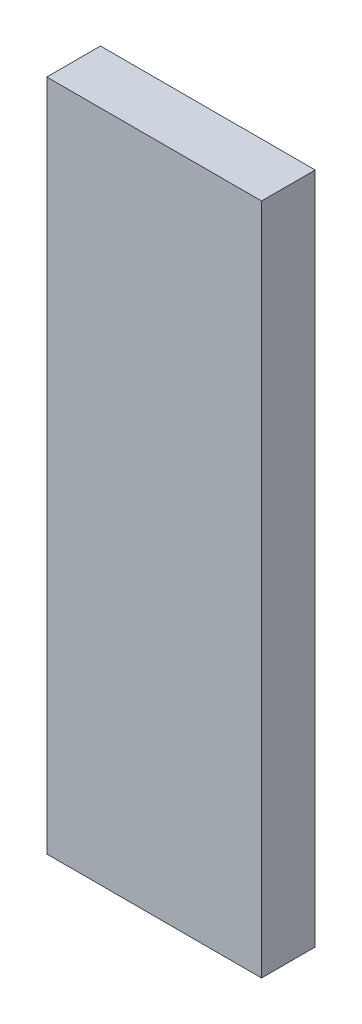
ISO-10303-21;
HEADER;
FILE_DESCRIPTION(('STEP AP214'),'2;1');
FILE_NAME('part.step','',(''),(''),'','','');
FILE_SCHEMA(('AUTOMOTIVE_DESIGN { 1 0 10303 214 1 1 1 1 }'));
ENDSEC;
DATA;
#1=APPLICATION_CONTEXT('core data for automotive mechanical design processes');
#2=APPLICATION_PROTOCOL_DEFINITION('international standard','automotive_design',2000,#1);
#3=PRODUCT_CONTEXT('',#1,'mechanical');
#4=PRODUCT('Part','Part','',(#3));
#5=PRODUCT_RELATED_PRODUCT_CATEGORY('part','',(#4));
#6=PRODUCT_DEFINITION_FORMATION('','',#4);
#7=PRODUCT_DEFINITION_CONTEXT('part definition',#1,'design');
#8=PRODUCT_DEFINITION('design','',#6,#7);
#9=PRODUCT_DEFINITION_SHAPE('','',#8);
#10=(LENGTH_UNIT() NAMED_UNIT(*) SI_UNIT(.MILLI.,.METRE.));
#11=(NAMED_UNIT(*) PLANE_ANGLE_UNIT() SI_UNIT($,.RADIAN.));
#12=(NAMED_UNIT(*) SI_UNIT($,.STERADIAN.) SOLID_ANGLE_UNIT());
#13=UNCERTAINTY_MEASURE_WITH_UNIT(LENGTH_MEASURE(1.E-05),#10,'distance_accuracy_value','');
#14=(GEOMETRIC_REPRESENTATION_CONTEXT(3) GLOBAL_UNCERTAINTY_ASSIGNED_CONTEXT((#13)) GLOBAL_UNIT_ASSIGNED_CONTEXT((#10,
#11,#12)) REPRESENTATION_CONTEXT('',''));
#15=CARTESIAN_POINT('',(0.,0.,0.));
#16=DIRECTION('',(0.,0.,1.));
#17=DIRECTION('',(1.,0.,0.));
#18=AXIS2_PLACEMENT_3D('',#15,#16,#17);
#19=CARTESIAN_POINT('',(-0.15,-0.47,0.075));
#20=DIRECTION('',(0.,0.,1.));
#21=DIRECTION('',(1.,0.,0.));
#22=AXIS2_PLACEMENT_3D('',#19,#20,#21);
#23=PLANE('',#22);
#24=DIRECTION('',(0.,1.,0.));
#25=VECTOR('',#24,1.);
#26=CARTESIAN_POINT('',(0.15,-0.47,0.075));
#27=LINE('',#26,#25);
#28=CARTESIAN_POINT('',(0.15,0.47,0.075));
#29=VERTEX_POINT('',#28);
#30=CARTESIAN_POINT('',(0.15,-0.47,0.075));
#31=VERTEX_POINT('',#30);
#32=EDGE_CURVE('E76',#29,#31,#27,.F.);
#33=ORIENTED_EDGE('',*,*,#32,.F.);
#34=DIRECTION('',(1.,0.,0.));
#35=VECTOR('',#34,1.);
#36=CARTESIAN_POINT('',(-0.15,0.47,0.075));
#37=LINE('',#36,#35);
#38=CARTESIAN_POINT('',(-0.15,0.47,0.075));
#39=VERTEX_POINT('',#38);
#40=EDGE_CURVE('E58',#39,#29,#37,.T.);
#41=ORIENTED_EDGE('',*,*,#40,.F.);
#42=DIRECTION('',(0.,1.,0.));
#43=VECTOR('',#42,1.);
#44=CARTESIAN_POINT('',(-0.15,-0.47,0.075));
#45=LINE('',#44,#43);
#46=CARTESIAN_POINT('',(-0.15,-0.47,0.075));
#47=VERTEX_POINT('',#46);
#48=EDGE_CURVE('E20',#39,#47,#45,.F.);
#49=ORIENTED_EDGE('',*,*,#48,.T.);
#50=DIRECTION('',(1.,0.,0.));
#51=VECTOR('',#50,1.);
#52=CARTESIAN_POINT('',(-0.15,-0.47,0.075));
#53=LINE('',#52,#51);
#54=EDGE_CURVE('E55',#47,#31,#53,.T.);
#55=ORIENTED_EDGE('',*,*,#54,.T.);
#56=EDGE_LOOP('',(#33,#41,#49,#55));
#57=FACE_BOUND('',#56,.T.);
#58=ADVANCED_FACE('F17',(#57),#23,.T.);
#59=CARTESIAN_POINT('',(-0.15,-0.47,0.));
#60=DIRECTION('',(1.,0.,0.));
#61=DIRECTION('',(0.,0.,-1.));
#62=AXIS2_PLACEMENT_3D('',#59,#60,#61);
#63=PLANE('',#62);
#64=DIRECTION('',(0.,0.,1.));
#65=VECTOR('',#64,1.);
#66=CARTESIAN_POINT('',(-0.15,0.47,0.));
#67=LINE('',#66,#65);
#68=CARTESIAN_POINT('',(-0.15,0.47,0.));
#69=VERTEX_POINT('',#68);
#70=EDGE_CURVE('E78',#69,#39,#67,.T.);
#71=ORIENTED_EDGE('',*,*,#70,.F.);
#72=DIRECTION('',(0.,1.,0.));
#73=VECTOR('',#72,1.);
#74=CARTESIAN_POINT('',(-0.15,-0.47,0.));
#75=LINE('',#74,#73);
#76=CARTESIAN_POINT('',(-0.15,-0.47,0.));
#77=VERTEX_POINT('',#76);
#78=EDGE_CURVE('E73',#69,#77,#75,.F.);
#79=ORIENTED_EDGE('',*,*,#78,.T.);
#80=DIRECTION('',(0.,0.,1.));
#81=VECTOR('',#80,1.);
#82=CARTESIAN_POINT('',(-0.15,-0.47,0.));
#83=LINE('',#82,#81);
#84=EDGE_CURVE('E63',#77,#47,#83,.T.);
#85=ORIENTED_EDGE('',*,*,#84,.T.);
#86=ORIENTED_EDGE('',*,*,#48,.F.);
#87=EDGE_LOOP('',(#71,#79,#85,#86));
#88=FACE_BOUND('',#87,.T.);
#89=ADVANCED_FACE('F72',(#88),#63,.F.);
#90=CARTESIAN_POINT('',(-0.15,-0.47,0.));
#91=DIRECTION('',(0.,1.,0.));
#92=DIRECTION('',(0.,0.,1.));
#93=AXIS2_PLACEMENT_3D('',#90,#91,#92);
#94=PLANE('',#93);
#95=ORIENTED_EDGE('',*,*,#54,.F.);
#96=ORIENTED_EDGE('',*,*,#84,.F.);
#97=DIRECTION('',(1.,0.,0.));
#98=VECTOR('',#97,1.);
#99=CARTESIAN_POINT('',(-0.15,-0.47,0.));
#100=LINE('',#99,#98);
#101=CARTESIAN_POINT('',(0.15,-0.47,0.));
#102=VERTEX_POINT('',#101);
#103=EDGE_CURVE('E83',#77,#102,#100,.T.);
#104=ORIENTED_EDGE('',*,*,#103,.T.);
#105=DIRECTION('',(0.,0.,-1.));
#106=VECTOR('',#105,1.);
#107=CARTESIAN_POINT('',(0.15,-0.47,0.));
#108=LINE('',#107,#106);
#109=EDGE_CURVE('E69',#31,#102,#108,.T.);
#110=ORIENTED_EDGE('',*,*,#109,.F.);
#111=EDGE_LOOP('',(#95,#96,#104,#110));
#112=FACE_BOUND('',#111,.T.);
#113=ADVANCED_FACE('F66',(#112),#94,.F.);
#114=CARTESIAN_POINT('',(0.15,-0.47,0.));
#115=DIRECTION('',(1.,0.,0.));
#116=DIRECTION('',(0.,0.,-1.));
#117=AXIS2_PLACEMENT_3D('',#114,#115,#116);
#118=PLANE('',#117);
#119=DIRECTION('',(0.,0.,1.));
#120=VECTOR('',#119,1.);
#121=CARTESIAN_POINT('',(0.15,0.47,0.));
#122=LINE('',#121,#120);
#123=CARTESIAN_POINT('',(0.15,0.47,0.));
#124=VERTEX_POINT('',#123);
#125=EDGE_CURVE('E34',#29,#124,#122,.F.);
#126=ORIENTED_EDGE('',*,*,#125,.F.);
#127=ORIENTED_EDGE('',*,*,#32,.T.);
#128=ORIENTED_EDGE('',*,*,#109,.T.);
#129=DIRECTION('',(0.,1.,0.));
#130=VECTOR('',#129,1.);
#131=CARTESIAN_POINT('',(0.15,-0.47,0.));
#132=LINE('',#131,#130);
#133=EDGE_CURVE('E26',#102,#124,#132,.T.);
#134=ORIENTED_EDGE('',*,*,#133,.T.);
#135=EDGE_LOOP('',(#126,#127,#128,#134));
#136=FACE_BOUND('',#135,.T.);
#137=ADVANCED_FACE('F88',(#136),#118,.T.);
#138=CARTESIAN_POINT('',(-0.15,0.47,0.));
#139=DIRECTION('',(0.,1.,0.));
#140=DIRECTION('',(0.,0.,1.));
#141=AXIS2_PLACEMENT_3D('',#138,#139,#140);
#142=PLANE('',#141);
#143=ORIENTED_EDGE('',*,*,#40,.T.);
#144=ORIENTED_EDGE('',*,*,#125,.T.);
#145=DIRECTION('',(1.,0.,0.));
#146=VECTOR('',#145,1.);
#147=CARTESIAN_POINT('',(-0.15,0.47,0.));
#148=LINE('',#147,#146);
#149=EDGE_CURVE('E11',#124,#69,#148,.F.);
#150=ORIENTED_EDGE('',*,*,#149,.T.);
#151=ORIENTED_EDGE('',*,*,#70,.T.);
#152=EDGE_LOOP('',(#143,#144,#150,#151));
#153=FACE_BOUND('',#152,.T.);
#154=ADVANCED_FACE('F91',(#153),#142,.T.);
#155=CARTESIAN_POINT('',(-0.15,-0.47,0.));
#156=DIRECTION('',(0.,0.,1.));
#157=DIRECTION('',(1.,0.,0.));
#158=AXIS2_PLACEMENT_3D('',#155,#156,#157);
#159=PLANE('',#158);
#160=ORIENTED_EDGE('',*,*,#133,.F.);
#161=ORIENTED_EDGE('',*,*,#103,.F.);
#162=ORIENTED_EDGE('',*,*,#78,.F.);
#163=ORIENTED_EDGE('',*,*,#149,.F.);
#164=EDGE_LOOP('',(#160,#161,#162,#163));
#165=FACE_BOUND('',#164,.T.);
#166=ADVANCED_FACE('F90',(#165),#159,.F.);
#167=CLOSED_SHELL('',(#58,#89,#113,#137,#154,#166));
#168=MANIFOLD_SOLID_BREP('B1',#167);
#169=ADVANCED_BREP_SHAPE_REPRESENTATION('',(#18,#168),#14);
#170=SHAPE_DEFINITION_REPRESENTATION(#9,#169);
ENDSEC;
END-ISO-10303-21;
